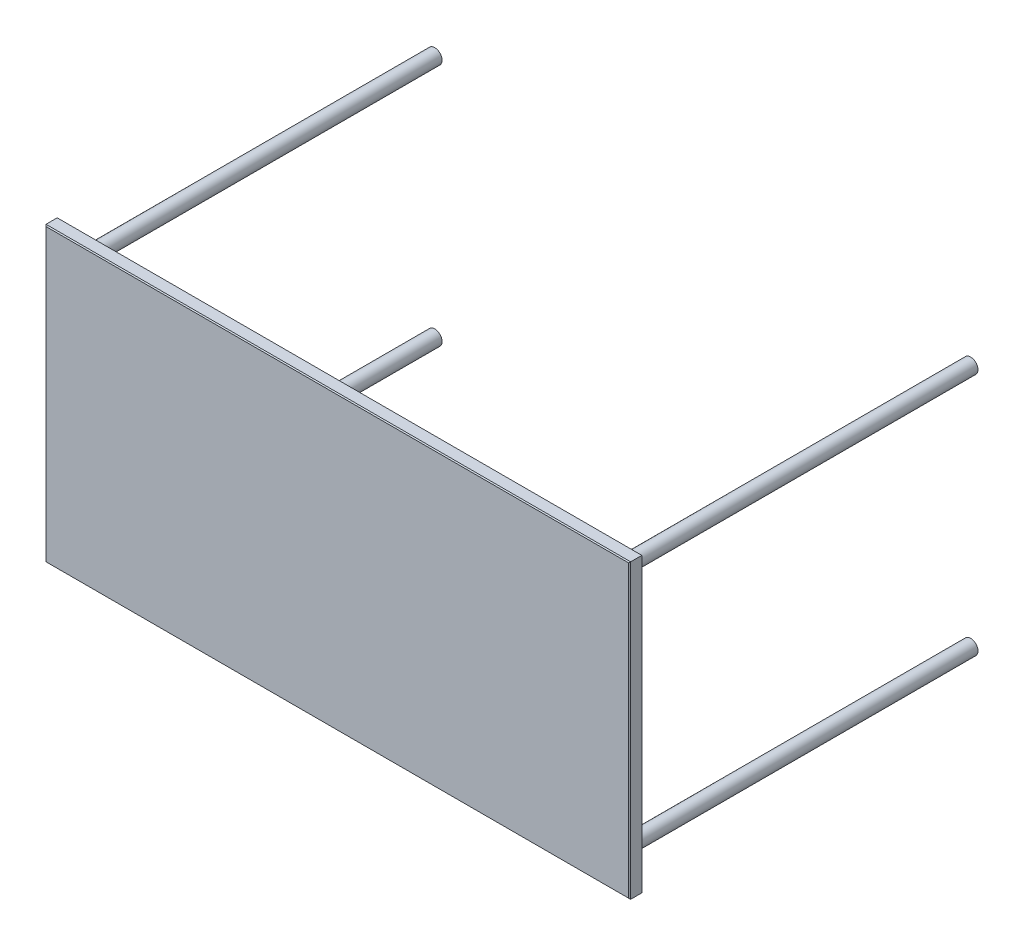
ISO-10303-21;
HEADER;
FILE_DESCRIPTION(('STEP AP214'),'2;1');
FILE_NAME('part.step','',(''),(''),'','','');
FILE_SCHEMA(('AUTOMOTIVE_DESIGN { 1 0 10303 214 1 1 1 1 }'));
ENDSEC;
DATA;
#1=APPLICATION_CONTEXT('core data for automotive mechanical design processes');
#2=APPLICATION_PROTOCOL_DEFINITION('international standard','automotive_design',2000,#1);
#3=PRODUCT_CONTEXT('',#1,'mechanical');
#4=PRODUCT('Part','Part','',(#3));
#5=PRODUCT_RELATED_PRODUCT_CATEGORY('part','',(#4));
#6=PRODUCT_DEFINITION_FORMATION('','',#4);
#7=PRODUCT_DEFINITION_CONTEXT('part definition',#1,'design');
#8=PRODUCT_DEFINITION('design','',#6,#7);
#9=PRODUCT_DEFINITION_SHAPE('','',#8);
#10=(LENGTH_UNIT() NAMED_UNIT(*) SI_UNIT(.MILLI.,.METRE.));
#11=(NAMED_UNIT(*) PLANE_ANGLE_UNIT() SI_UNIT($,.RADIAN.));
#12=(NAMED_UNIT(*) SI_UNIT($,.STERADIAN.) SOLID_ANGLE_UNIT());
#13=UNCERTAINTY_MEASURE_WITH_UNIT(LENGTH_MEASURE(1.E-05),#10,'distance_accuracy_value','');
#14=(GEOMETRIC_REPRESENTATION_CONTEXT(3) GLOBAL_UNCERTAINTY_ASSIGNED_CONTEXT((#13)) GLOBAL_UNIT_ASSIGNED_CONTEXT((#10,
#11,#12)) REPRESENTATION_CONTEXT('',''));
#15=CARTESIAN_POINT('',(0.,0.,0.));
#16=DIRECTION('',(0.,0.,1.));
#17=DIRECTION('',(1.,0.,0.));
#18=AXIS2_PLACEMENT_3D('',#15,#16,#17);
#19=CARTESIAN_POINT('',(600.,-300.,25.));
#20=DIRECTION('',(-1.,0.,0.));
#21=DIRECTION('',(0.,0.,1.));
#22=AXIS2_PLACEMENT_3D('',#19,#20,#21);
#23=PLANE('',#22);
#24=DIRECTION('',(0.,0.,-1.));
#25=VECTOR('',#24,1.);
#26=CARTESIAN_POINT('',(600.,300.,25.));
#27=LINE('',#26,#25);
#28=CARTESIAN_POINT('',(600.,300.,22.9999999999998));
#29=VERTEX_POINT('',#28);
#30=CARTESIAN_POINT('',(600.,300.,0.));
#31=VERTEX_POINT('',#30);
#32=EDGE_CURVE('E96',#29,#31,#27,.T.);
#33=ORIENTED_EDGE('',*,*,#32,.F.);
#34=DIRECTION('',(0.,-1.,0.));
#35=VECTOR('',#34,1.);
#36=CARTESIAN_POINT('',(600.,-300.,22.9999999999998));
#37=LINE('',#36,#35);
#38=CARTESIAN_POINT('',(600.,-300.,22.9999999999998));
#39=VERTEX_POINT('',#38);
#40=EDGE_CURVE('E11',#29,#39,#37,.T.);
#41=ORIENTED_EDGE('',*,*,#40,.T.);
#42=DIRECTION('',(0.,0.,-1.));
#43=VECTOR('',#42,1.);
#44=CARTESIAN_POINT('',(600.,-300.,25.));
#45=LINE('',#44,#43);
#46=CARTESIAN_POINT('',(600.,-300.,0.));
#47=VERTEX_POINT('',#46);
#48=EDGE_CURVE('E118',#39,#47,#45,.T.);
#49=ORIENTED_EDGE('',*,*,#48,.T.);
#50=DIRECTION('',(0.,1.,0.));
#51=VECTOR('',#50,1.);
#52=CARTESIAN_POINT('',(600.,-300.,0.));
#53=LINE('',#52,#51);
#54=EDGE_CURVE('E112',#47,#31,#53,.T.);
#55=ORIENTED_EDGE('',*,*,#54,.T.);
#56=EDGE_LOOP('',(#33,#41,#49,#55));
#57=FACE_BOUND('',#56,.T.);
#58=ADVANCED_FACE('F43',(#57),#23,.F.);
#59=CARTESIAN_POINT('',(-600.,300.,25.));
#60=DIRECTION('',(0.,-1.,0.));
#61=DIRECTION('',(0.,0.,-1.));
#62=AXIS2_PLACEMENT_3D('',#59,#60,#61);
#63=PLANE('',#62);
#64=DIRECTION('',(0.,0.,-1.));
#65=VECTOR('',#64,1.);
#66=CARTESIAN_POINT('',(-600.,300.,25.));
#67=LINE('',#66,#65);
#68=CARTESIAN_POINT('',(-600.,300.,22.9999999999998));
#69=VERTEX_POINT('',#68);
#70=CARTESIAN_POINT('',(-600.,300.,0.));
#71=VERTEX_POINT('',#70);
#72=EDGE_CURVE('E104',#69,#71,#67,.T.);
#73=ORIENTED_EDGE('',*,*,#72,.F.);
#74=DIRECTION('',(1.,0.,0.));
#75=VECTOR('',#74,1.);
#76=CARTESIAN_POINT('',(-600.,300.,22.9999999999998));
#77=LINE('',#76,#75);
#78=EDGE_CURVE('E52',#69,#29,#77,.T.);
#79=ORIENTED_EDGE('',*,*,#78,.T.);
#80=ORIENTED_EDGE('',*,*,#32,.T.);
#81=DIRECTION('',(-1.,0.,0.));
#82=VECTOR('',#81,1.);
#83=CARTESIAN_POINT('',(-600.,300.,0.));
#84=LINE('',#83,#82);
#85=EDGE_CURVE('E97',#31,#71,#84,.T.);
#86=ORIENTED_EDGE('',*,*,#85,.T.);
#87=EDGE_LOOP('',(#73,#79,#80,#86));
#88=FACE_BOUND('',#87,.T.);
#89=ADVANCED_FACE('F98',(#88),#63,.F.);
#90=CARTESIAN_POINT('',(-600.,-300.,25.));
#91=DIRECTION('',(1.,0.,0.));
#92=DIRECTION('',(0.,0.,-1.));
#93=AXIS2_PLACEMENT_3D('',#90,#91,#92);
#94=PLANE('',#93);
#95=DIRECTION('',(0.,0.,-1.));
#96=VECTOR('',#95,1.);
#97=CARTESIAN_POINT('',(-600.,-300.,25.));
#98=LINE('',#97,#96);
#99=CARTESIAN_POINT('',(-600.,-300.,22.9999999999998));
#100=VERTEX_POINT('',#99);
#101=CARTESIAN_POINT('',(-600.,-300.,0.));
#102=VERTEX_POINT('',#101);
#103=EDGE_CURVE('E129',#100,#102,#98,.T.);
#104=ORIENTED_EDGE('',*,*,#103,.F.);
#105=DIRECTION('',(0.,1.,0.));
#106=VECTOR('',#105,1.);
#107=CARTESIAN_POINT('',(-600.,-300.,22.9999999999998));
#108=LINE('',#107,#106);
#109=EDGE_CURVE('E67',#100,#69,#108,.T.);
#110=ORIENTED_EDGE('',*,*,#109,.T.);
#111=ORIENTED_EDGE('',*,*,#72,.T.);
#112=DIRECTION('',(0.,-1.,0.));
#113=VECTOR('',#112,1.);
#114=CARTESIAN_POINT('',(-600.,-300.,0.));
#115=LINE('',#114,#113);
#116=EDGE_CURVE('E114',#71,#102,#115,.T.);
#117=ORIENTED_EDGE('',*,*,#116,.T.);
#118=EDGE_LOOP('',(#104,#110,#111,#117));
#119=FACE_BOUND('',#118,.T.);
#120=ADVANCED_FACE('F202',(#119),#94,.F.);
#121=CARTESIAN_POINT('',(-600.,-300.,25.));
#122=DIRECTION('',(0.,1.,0.));
#123=DIRECTION('',(0.,0.,1.));
#124=AXIS2_PLACEMENT_3D('',#121,#122,#123);
#125=PLANE('',#124);
#126=ORIENTED_EDGE('',*,*,#48,.F.);
#127=DIRECTION('',(-1.,0.,0.));
#128=VECTOR('',#127,1.);
#129=CARTESIAN_POINT('',(-600.,-300.,22.9999999999998));
#130=LINE('',#129,#128);
#131=EDGE_CURVE('E139',#39,#100,#130,.T.);
#132=ORIENTED_EDGE('',*,*,#131,.T.);
#133=ORIENTED_EDGE('',*,*,#103,.T.);
#134=DIRECTION('',(1.,0.,0.));
#135=VECTOR('',#134,1.);
#136=CARTESIAN_POINT('',(-600.,-300.,0.));
#137=LINE('',#136,#135);
#138=EDGE_CURVE('E127',#102,#47,#137,.T.);
#139=ORIENTED_EDGE('',*,*,#138,.T.);
#140=EDGE_LOOP('',(#126,#132,#133,#139));
#141=FACE_BOUND('',#140,.T.);
#142=ADVANCED_FACE('F243',(#141),#125,.F.);
#143=CARTESIAN_POINT('',(0.,0.,25.));
#144=DIRECTION('',(0.,0.,-1.));
#145=DIRECTION('',(-1.,0.,0.));
#146=AXIS2_PLACEMENT_3D('',#143,#144,#145);
#147=PLANE('',#146);
#148=DIRECTION('',(0.,-1.,0.));
#149=VECTOR('',#148,1.);
#150=CARTESIAN_POINT('',(-598.,0.,25.));
#151=LINE('',#150,#149);
#152=CARTESIAN_POINT('',(-598.,298.,25.));
#153=VERTEX_POINT('',#152);
#154=CARTESIAN_POINT('',(-598.,-298.,25.));
#155=VERTEX_POINT('',#154);
#156=EDGE_CURVE('E131',#153,#155,#151,.T.);
#157=ORIENTED_EDGE('',*,*,#156,.T.);
#158=DIRECTION('',(1.,0.,0.));
#159=VECTOR('',#158,1.);
#160=CARTESIAN_POINT('',(0.,-298.,25.));
#161=LINE('',#160,#159);
#162=CARTESIAN_POINT('',(598.,-298.,25.));
#163=VERTEX_POINT('',#162);
#164=EDGE_CURVE('E140',#155,#163,#161,.T.);
#165=ORIENTED_EDGE('',*,*,#164,.T.);
#166=DIRECTION('',(0.,1.,0.));
#167=VECTOR('',#166,1.);
#168=CARTESIAN_POINT('',(598.,0.,25.));
#169=LINE('',#168,#167);
#170=CARTESIAN_POINT('',(598.,298.,25.));
#171=VERTEX_POINT('',#170);
#172=EDGE_CURVE('E102',#163,#171,#169,.T.);
#173=ORIENTED_EDGE('',*,*,#172,.T.);
#174=DIRECTION('',(-1.,0.,0.));
#175=VECTOR('',#174,1.);
#176=CARTESIAN_POINT('',(0.,298.,25.));
#177=LINE('',#176,#175);
#178=EDGE_CURVE('E132',#171,#153,#177,.T.);
#179=ORIENTED_EDGE('',*,*,#178,.T.);
#180=EDGE_LOOP('',(#157,#165,#173,#179));
#181=FACE_BOUND('',#180,.T.);
#182=ADVANCED_FACE('F194',(#181),#147,.F.);
#183=CARTESIAN_POINT('',(0.,0.,0.));
#184=DIRECTION('',(0.,0.,-1.));
#185=DIRECTION('',(-1.,0.,0.));
#186=AXIS2_PLACEMENT_3D('',#183,#184,#185);
#187=PLANE('',#186);
#188=CARTESIAN_POINT('',(550.,-250.,0.));
#189=DIRECTION('',(0.,0.,1.));
#190=DIRECTION('',(1.,0.,0.));
#191=AXIS2_PLACEMENT_3D('',#188,#189,#190);
#192=CIRCLE('',#191,15.);
#193=CARTESIAN_POINT('',(565.,-250.,0.));
#194=VERTEX_POINT('',#193);
#195=EDGE_CURVE('E157',#194,#194,#192,.T.);
#196=ORIENTED_EDGE('',*,*,#195,.T.);
#197=EDGE_LOOP('',(#196));
#198=FACE_BOUND('',#197,.T.);
#199=CARTESIAN_POINT('',(-550.,-250.,0.));
#200=DIRECTION('',(0.,0.,1.));
#201=DIRECTION('',(1.,0.,0.));
#202=AXIS2_PLACEMENT_3D('',#199,#200,#201);
#203=CIRCLE('',#202,15.);
#204=CARTESIAN_POINT('',(-535.,-250.,0.));
#205=VERTEX_POINT('',#204);
#206=EDGE_CURVE('E166',#205,#205,#203,.T.);
#207=ORIENTED_EDGE('',*,*,#206,.T.);
#208=EDGE_LOOP('',(#207));
#209=FACE_BOUND('',#208,.T.);
#210=CARTESIAN_POINT('',(-550.,250.,0.));
#211=DIRECTION('',(0.,0.,1.));
#212=DIRECTION('',(1.,0.,0.));
#213=AXIS2_PLACEMENT_3D('',#210,#211,#212);
#214=CIRCLE('',#213,15.);
#215=CARTESIAN_POINT('',(-535.,250.,0.));
#216=VERTEX_POINT('',#215);
#217=EDGE_CURVE('E171',#216,#216,#214,.T.);
#218=ORIENTED_EDGE('',*,*,#217,.T.);
#219=EDGE_LOOP('',(#218));
#220=FACE_BOUND('',#219,.T.);
#221=CARTESIAN_POINT('',(550.,250.,0.));
#222=DIRECTION('',(0.,0.,1.));
#223=DIRECTION('',(1.,0.,0.));
#224=AXIS2_PLACEMENT_3D('',#221,#222,#223);
#225=CIRCLE('',#224,15.);
#226=CARTESIAN_POINT('',(565.,250.,0.));
#227=VERTEX_POINT('',#226);
#228=EDGE_CURVE('E121',#227,#227,#225,.T.);
#229=ORIENTED_EDGE('',*,*,#228,.T.);
#230=EDGE_LOOP('',(#229));
#231=FACE_BOUND('',#230,.T.);
#232=ORIENTED_EDGE('',*,*,#54,.F.);
#233=ORIENTED_EDGE('',*,*,#138,.F.);
#234=ORIENTED_EDGE('',*,*,#116,.F.);
#235=ORIENTED_EDGE('',*,*,#85,.F.);
#236=EDGE_LOOP('',(#232,#233,#234,#235));
#237=FACE_BOUND('',#236,.T.);
#238=ADVANCED_FACE('F108',(#198,#209,#220,#231,#237),#187,.T.);
#239=CARTESIAN_POINT('',(550.,250.,-725.));
#240=DIRECTION('',(0.,0.,1.));
#241=DIRECTION('',(1.,0.,0.));
#242=AXIS2_PLACEMENT_3D('',#239,#240,#241);
#243=CYLINDRICAL_SURFACE('',#242,15.);
#244=CARTESIAN_POINT('',(550.,250.,-725.));
#245=DIRECTION('',(0.,0.,1.));
#246=DIRECTION('',(1.,0.,0.));
#247=AXIS2_PLACEMENT_3D('',#244,#245,#246);
#248=CIRCLE('',#247,15.);
#249=CARTESIAN_POINT('',(565.,250.,-725.));
#250=VERTEX_POINT('',#249);
#251=EDGE_CURVE('E117',#250,#250,#248,.T.);
#252=ORIENTED_EDGE('',*,*,#251,.T.);
#253=EDGE_LOOP('',(#252));
#254=FACE_BOUND('',#253,.T.);
#255=ORIENTED_EDGE('',*,*,#228,.F.);
#256=EDGE_LOOP('',(#255));
#257=FACE_BOUND('',#256,.T.);
#258=ADVANCED_FACE('F181',(#254,#257),#243,.T.);
#259=CARTESIAN_POINT('',(550.,250.,-725.));
#260=DIRECTION('',(0.,0.,1.));
#261=DIRECTION('',(1.,0.,0.));
#262=AXIS2_PLACEMENT_3D('',#259,#260,#261);
#263=PLANE('',#262);
#264=ORIENTED_EDGE('',*,*,#251,.F.);
#265=EDGE_LOOP('',(#264));
#266=FACE_BOUND('',#265,.T.);
#267=ADVANCED_FACE('F183',(#266),#263,.F.);
#268=CARTESIAN_POINT('',(-550.,250.,-725.));
#269=DIRECTION('',(0.,0.,1.));
#270=DIRECTION('',(1.,0.,0.));
#271=AXIS2_PLACEMENT_3D('',#268,#269,#270);
#272=CYLINDRICAL_SURFACE('',#271,15.);
#273=CARTESIAN_POINT('',(-550.,250.,-725.));
#274=DIRECTION('',(0.,0.,1.));
#275=DIRECTION('',(1.,0.,0.));
#276=AXIS2_PLACEMENT_3D('',#273,#274,#275);
#277=CIRCLE('',#276,15.);
#278=CARTESIAN_POINT('',(-535.,250.,-725.));
#279=VERTEX_POINT('',#278);
#280=EDGE_CURVE('E174',#279,#279,#277,.T.);
#281=ORIENTED_EDGE('',*,*,#280,.T.);
#282=EDGE_LOOP('',(#281));
#283=FACE_BOUND('',#282,.T.);
#284=ORIENTED_EDGE('',*,*,#217,.F.);
#285=EDGE_LOOP('',(#284));
#286=FACE_BOUND('',#285,.T.);
#287=ADVANCED_FACE('F195',(#283,#286),#272,.T.);
#288=CARTESIAN_POINT('',(-550.,250.,-725.));
#289=DIRECTION('',(0.,0.,1.));
#290=DIRECTION('',(1.,0.,0.));
#291=AXIS2_PLACEMENT_3D('',#288,#289,#290);
#292=PLANE('',#291);
#293=ORIENTED_EDGE('',*,*,#280,.F.);
#294=EDGE_LOOP('',(#293));
#295=FACE_BOUND('',#294,.T.);
#296=ADVANCED_FACE('F288',(#295),#292,.F.);
#297=CARTESIAN_POINT('',(-550.,-250.,-725.));
#298=DIRECTION('',(0.,0.,1.));
#299=DIRECTION('',(1.,0.,0.));
#300=AXIS2_PLACEMENT_3D('',#297,#298,#299);
#301=CYLINDRICAL_SURFACE('',#300,15.);
#302=CARTESIAN_POINT('',(-550.,-250.,-725.));
#303=DIRECTION('',(0.,0.,1.));
#304=DIRECTION('',(1.,0.,0.));
#305=AXIS2_PLACEMENT_3D('',#302,#303,#304);
#306=CIRCLE('',#305,15.);
#307=CARTESIAN_POINT('',(-535.,-250.,-725.));
#308=VERTEX_POINT('',#307);
#309=EDGE_CURVE('E163',#308,#308,#306,.T.);
#310=ORIENTED_EDGE('',*,*,#309,.T.);
#311=EDGE_LOOP('',(#310));
#312=FACE_BOUND('',#311,.T.);
#313=ORIENTED_EDGE('',*,*,#206,.F.);
#314=EDGE_LOOP('',(#313));
#315=FACE_BOUND('',#314,.T.);
#316=ADVANCED_FACE('F300',(#312,#315),#301,.T.);
#317=CARTESIAN_POINT('',(-550.,-250.,-725.));
#318=DIRECTION('',(0.,0.,1.));
#319=DIRECTION('',(1.,0.,0.));
#320=AXIS2_PLACEMENT_3D('',#317,#318,#319);
#321=PLANE('',#320);
#322=ORIENTED_EDGE('',*,*,#309,.F.);
#323=EDGE_LOOP('',(#322));
#324=FACE_BOUND('',#323,.T.);
#325=ADVANCED_FACE('F310',(#324),#321,.F.);
#326=CARTESIAN_POINT('',(550.,-250.,-725.));
#327=DIRECTION('',(0.,0.,1.));
#328=DIRECTION('',(1.,0.,0.));
#329=AXIS2_PLACEMENT_3D('',#326,#327,#328);
#330=CYLINDRICAL_SURFACE('',#329,15.);
#331=CARTESIAN_POINT('',(550.,-250.,-725.));
#332=DIRECTION('',(0.,0.,1.));
#333=DIRECTION('',(1.,0.,0.));
#334=AXIS2_PLACEMENT_3D('',#331,#332,#333);
#335=CIRCLE('',#334,15.);
#336=CARTESIAN_POINT('',(565.,-250.,-725.));
#337=VERTEX_POINT('',#336);
#338=EDGE_CURVE('E152',#337,#337,#335,.T.);
#339=ORIENTED_EDGE('',*,*,#338,.T.);
#340=EDGE_LOOP('',(#339));
#341=FACE_BOUND('',#340,.T.);
#342=ORIENTED_EDGE('',*,*,#195,.F.);
#343=EDGE_LOOP('',(#342));
#344=FACE_BOUND('',#343,.T.);
#345=ADVANCED_FACE('F233',(#341,#344),#330,.T.);
#346=CARTESIAN_POINT('',(550.,-250.,-725.));
#347=DIRECTION('',(0.,0.,1.));
#348=DIRECTION('',(1.,0.,0.));
#349=AXIS2_PLACEMENT_3D('',#346,#347,#348);
#350=PLANE('',#349);
#351=ORIENTED_EDGE('',*,*,#338,.F.);
#352=EDGE_LOOP('',(#351));
#353=FACE_BOUND('',#352,.T.);
#354=ADVANCED_FACE('F230',(#353),#350,.F.);
#355=CARTESIAN_POINT('',(0.,298.,25.));
#356=DIRECTION('',(0.,-0.707106781186548,-0.707106781186548));
#357=DIRECTION('',(-1.,0.,0.));
#358=AXIS2_PLACEMENT_3D('',#355,#356,#357);
#359=PLANE('',#358);
#360=DIRECTION('',(-0.577350269189626,-0.577350269189626,0.577350269189626));
#361=VECTOR('',#360,1.);
#362=CARTESIAN_POINT('',(498.666666666666,198.666666666666,124.333333333333));
#363=LINE('',#362,#361);
#364=EDGE_CURVE('E146',#29,#171,#363,.T.);
#365=ORIENTED_EDGE('',*,*,#364,.F.);
#366=ORIENTED_EDGE('',*,*,#78,.F.);
#367=DIRECTION('',(0.577350269189626,-0.577350269189626,0.577350269189626));
#368=VECTOR('',#367,1.);
#369=CARTESIAN_POINT('',(-398.666666666666,98.6666666666665,224.333333333333));
#370=LINE('',#369,#368);
#371=EDGE_CURVE('E48',#153,#69,#370,.F.);
#372=ORIENTED_EDGE('',*,*,#371,.F.);
#373=ORIENTED_EDGE('',*,*,#178,.F.);
#374=EDGE_LOOP('',(#365,#366,#372,#373));
#375=FACE_BOUND('',#374,.T.);
#376=ADVANCED_FACE('F46',(#375),#359,.F.);
#377=CARTESIAN_POINT('',(-598.,0.,25.));
#378=DIRECTION('',(0.707106781186548,0.,-0.707106781186548));
#379=DIRECTION('',(0.,-1.,0.));
#380=AXIS2_PLACEMENT_3D('',#377,#378,#379);
#381=PLANE('',#380);
#382=ORIENTED_EDGE('',*,*,#371,.T.);
#383=ORIENTED_EDGE('',*,*,#109,.F.);
#384=DIRECTION('',(0.577350269189626,0.577350269189626,0.577350269189626));
#385=VECTOR('',#384,1.);
#386=CARTESIAN_POINT('',(-498.666666666666,-198.666666666666,124.333333333333));
#387=LINE('',#386,#385);
#388=EDGE_CURVE('E150',#155,#100,#387,.F.);
#389=ORIENTED_EDGE('',*,*,#388,.F.);
#390=ORIENTED_EDGE('',*,*,#156,.F.);
#391=EDGE_LOOP('',(#382,#383,#389,#390));
#392=FACE_BOUND('',#391,.T.);
#393=ADVANCED_FACE('F225',(#392),#381,.F.);
#394=CARTESIAN_POINT('',(598.,0.,25.));
#395=DIRECTION('',(-0.707106781186548,0.,-0.707106781186548));
#396=DIRECTION('',(0.,1.,0.));
#397=AXIS2_PLACEMENT_3D('',#394,#395,#396);
#398=PLANE('',#397);
#399=ORIENTED_EDGE('',*,*,#364,.T.);
#400=ORIENTED_EDGE('',*,*,#172,.F.);
#401=DIRECTION('',(0.577350269189626,-0.577350269189626,-0.577350269189626));
#402=VECTOR('',#401,1.);
#403=CARTESIAN_POINT('',(498.666666666666,-198.666666666666,124.333333333333));
#404=LINE('',#403,#402);
#405=EDGE_CURVE('E144',#39,#163,#404,.F.);
#406=ORIENTED_EDGE('',*,*,#405,.F.);
#407=ORIENTED_EDGE('',*,*,#40,.F.);
#408=EDGE_LOOP('',(#399,#400,#406,#407));
#409=FACE_BOUND('',#408,.T.);
#410=ADVANCED_FACE('F216',(#409),#398,.F.);
#411=CARTESIAN_POINT('',(0.,-298.,25.));
#412=DIRECTION('',(0.,0.707106781186548,-0.707106781186548));
#413=DIRECTION('',(1.,0.,0.));
#414=AXIS2_PLACEMENT_3D('',#411,#412,#413);
#415=PLANE('',#414);
#416=ORIENTED_EDGE('',*,*,#388,.T.);
#417=ORIENTED_EDGE('',*,*,#131,.F.);
#418=ORIENTED_EDGE('',*,*,#405,.T.);
#419=ORIENTED_EDGE('',*,*,#164,.F.);
#420=EDGE_LOOP('',(#416,#417,#418,#419));
#421=FACE_BOUND('',#420,.T.);
#422=ADVANCED_FACE('F209',(#421),#415,.F.);
#423=CLOSED_SHELL('',(#58,#89,#120,#142,#182,#238,#258,#267,#287,#296,#316,#325,#345,#354,#376,
#393,#410,#422));
#424=MANIFOLD_SOLID_BREP('B2',#423);
#425=ADVANCED_BREP_SHAPE_REPRESENTATION('',(#18,#424),#14);
#426=SHAPE_DEFINITION_REPRESENTATION(#9,#425);
ENDSEC;
END-ISO-10303-21;
